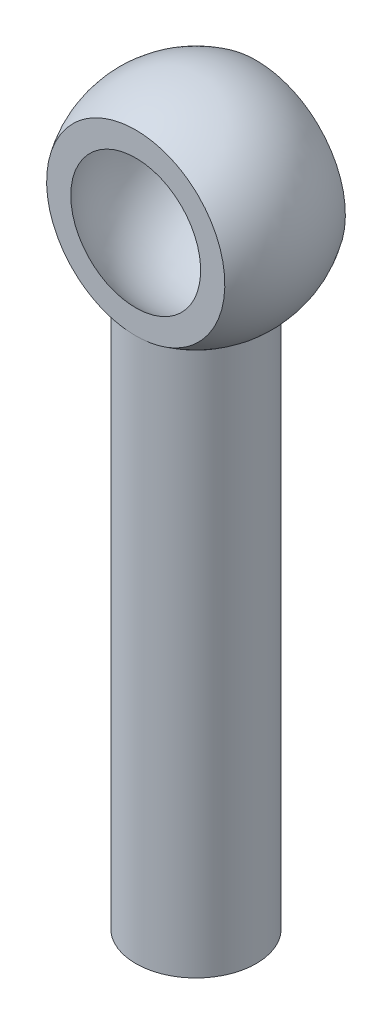
ISO-10303-21;
HEADER;
FILE_DESCRIPTION(('STEP AP214'),'2;1');
FILE_NAME('part.step','',(''),(''),'','','');
FILE_SCHEMA(('AUTOMOTIVE_DESIGN { 1 0 10303 214 1 1 1 1 }'));
ENDSEC;
DATA;
#1=APPLICATION_CONTEXT('core data for automotive mechanical design processes');
#2=APPLICATION_PROTOCOL_DEFINITION('international standard','automotive_design',2000,#1);
#3=PRODUCT_CONTEXT('',#1,'mechanical');
#4=PRODUCT('Part','Part','',(#3));
#5=PRODUCT_RELATED_PRODUCT_CATEGORY('part','',(#4));
#6=PRODUCT_DEFINITION_FORMATION('','',#4);
#7=PRODUCT_DEFINITION_CONTEXT('part definition',#1,'design');
#8=PRODUCT_DEFINITION('design','',#6,#7);
#9=PRODUCT_DEFINITION_SHAPE('','',#8);
#10=(LENGTH_UNIT() NAMED_UNIT(*) SI_UNIT(.MILLI.,.METRE.));
#11=(NAMED_UNIT(*) PLANE_ANGLE_UNIT() SI_UNIT($,.RADIAN.));
#12=(NAMED_UNIT(*) SI_UNIT($,.STERADIAN.) SOLID_ANGLE_UNIT());
#13=UNCERTAINTY_MEASURE_WITH_UNIT(LENGTH_MEASURE(1.E-05),#10,'distance_accuracy_value','');
#14=(GEOMETRIC_REPRESENTATION_CONTEXT(3) GLOBAL_UNCERTAINTY_ASSIGNED_CONTEXT((#13)) GLOBAL_UNIT_ASSIGNED_CONTEXT((#10,
#11,#12)) REPRESENTATION_CONTEXT('',''));
#15=CARTESIAN_POINT('',(0.,0.,0.));
#16=DIRECTION('',(0.,0.,1.));
#17=DIRECTION('',(1.,0.,0.));
#18=AXIS2_PLACEMENT_3D('',#15,#16,#17);
#19=CARTESIAN_POINT('',(0.,50.,0.));
#20=DIRECTION('',(0.,1.,0.));
#21=DIRECTION('',(-1.,0.,0.));
#22=AXIS2_PLACEMENT_3D('',#19,#20,#21);
#23=SPHERICAL_SURFACE('',#22,8.5);
#24=CARTESIAN_POINT('',(0.,42.959503302323,0.));
#25=DIRECTION('',(0.,1.,0.));
#26=DIRECTION('',(0.,0.,1.));
#27=AXIS2_PLACEMENT_3D('',#24,#25,#26);
#28=CIRCLE('',#27,4.7625);
#29=CARTESIAN_POINT('',(0.,42.959503302323,4.7625));
#30=VERTEX_POINT('',#29);
#31=CARTESIAN_POINT('',(-0.154292741242095,42.959503302323,-4.76));
#32=VERTEX_POINT('',#31);
#33=EDGE_CURVE('E69',#30,#32,#28,.F.);
#34=ORIENTED_EDGE('',*,*,#33,.F.);
#35=CARTESIAN_POINT('',(0.,50.,4.7625));
#36=DIRECTION('',(0.,0.,-1.));
#37=DIRECTION('',(-1.,0.,0.));
#38=AXIS2_PLACEMENT_3D('',#35,#36,#37);
#39=CIRCLE('',#38,7.04049669767695);
#40=EDGE_CURVE('E59',#30,#30,#39,.F.);
#41=ORIENTED_EDGE('',*,*,#40,.F.);
#42=CARTESIAN_POINT('',(0.154292741242095,42.959503302323,-4.76));
#43=VERTEX_POINT('',#42);
#44=EDGE_CURVE('E70',#43,#30,#28,.F.);
#45=ORIENTED_EDGE('',*,*,#44,.F.);
#46=CARTESIAN_POINT('',(0.,50.,-4.76));
#47=DIRECTION('',(0.,0.,1.));
#48=DIRECTION('',(0.,-1.,0.));
#49=AXIS2_PLACEMENT_3D('',#46,#47,#48);
#50=CIRCLE('',#49,7.04218716025072);
#51=EDGE_CURVE('E11',#32,#43,#50,.F.);
#52=ORIENTED_EDGE('',*,*,#51,.F.);
#53=EDGE_LOOP('',(#34,#41,#45,#52));
#54=FACE_BOUND('',#53,.T.);
#55=ADVANCED_FACE('F38',(#54),#23,.T.);
#56=CARTESIAN_POINT('',(0.,50.,0.));
#57=DIRECTION('',(0.,-1.,0.));
#58=DIRECTION('',(0.,0.,-1.));
#59=AXIS2_PLACEMENT_3D('',#56,#57,#58);
#60=CYLINDRICAL_SURFACE('',#59,4.7625);
#61=ORIENTED_EDGE('',*,*,#33,.T.);
#62=CARTESIAN_POINT('',(0.,42.959503302323,0.));
#63=DIRECTION('',(0.,-1.,0.));
#64=DIRECTION('',(-0.0323974259825927,0.,-0.999475065616798));
#65=AXIS2_PLACEMENT_3D('',#62,#63,#64);
#66=CIRCLE('',#65,4.7625);
#67=EDGE_CURVE('E62',#32,#43,#66,.T.);
#68=ORIENTED_EDGE('',*,*,#67,.T.);
#69=ORIENTED_EDGE('',*,*,#44,.T.);
#70=EDGE_LOOP('',(#61,#68,#69));
#71=FACE_BOUND('',#70,.T.);
#72=CARTESIAN_POINT('',(0.,0.,0.));
#73=DIRECTION('',(0.,1.,0.));
#74=DIRECTION('',(0.,0.,1.));
#75=AXIS2_PLACEMENT_3D('',#72,#73,#74);
#76=CIRCLE('',#75,4.7625);
#77=CARTESIAN_POINT('',(0.,0.,4.7625));
#78=VERTEX_POINT('',#77);
#79=EDGE_CURVE('E48',#78,#78,#76,.T.);
#80=ORIENTED_EDGE('',*,*,#79,.T.);
#81=EDGE_LOOP('',(#80));
#82=FACE_BOUND('',#81,.T.);
#83=ADVANCED_FACE('F40',(#71,#82),#60,.T.);
#84=CARTESIAN_POINT('',(0.,0.,0.));
#85=DIRECTION('',(0.,1.,0.));
#86=DIRECTION('',(0.,0.,1.));
#87=AXIS2_PLACEMENT_3D('',#84,#85,#86);
#88=PLANE('',#87);
#89=ORIENTED_EDGE('',*,*,#79,.F.);
#90=EDGE_LOOP('',(#89));
#91=FACE_BOUND('',#90,.T.);
#92=ADVANCED_FACE('F115',(#91),#88,.F.);
#93=CARTESIAN_POINT('',(-8.5,42.959503302323,-4.76));
#94=DIRECTION('',(0.,0.,1.));
#95=DIRECTION('',(0.,-1.,0.));
#96=AXIS2_PLACEMENT_3D('',#93,#94,#95);
#97=PLANE('',#96);
#98=CARTESIAN_POINT('',(0.,50.,-4.76));
#99=DIRECTION('',(0.,0.,1.));
#100=DIRECTION('',(0.,-1.,0.));
#101=AXIS2_PLACEMENT_3D('',#98,#99,#100);
#102=CIRCLE('',#101,5.13248477835054);
#103=CARTESIAN_POINT('',(0.,44.8675152216495,-4.76));
#104=VERTEX_POINT('',#103);
#105=EDGE_CURVE('E86',#104,#104,#102,.T.);
#106=ORIENTED_EDGE('',*,*,#105,.T.);
#107=EDGE_LOOP('',(#106));
#108=FACE_BOUND('',#107,.T.);
#109=ORIENTED_EDGE('',*,*,#51,.T.);
#110=ORIENTED_EDGE('',*,*,#67,.F.);
#111=EDGE_LOOP('',(#109,#110));
#112=FACE_BOUND('',#111,.T.);
#113=ADVANCED_FACE('F64',(#108,#112),#97,.F.);
#114=CARTESIAN_POINT('',(-8.5,42.959503302323,4.7625));
#115=DIRECTION('',(0.,0.,-1.));
#116=DIRECTION('',(-1.,0.,0.));
#117=AXIS2_PLACEMENT_3D('',#114,#115,#116);
#118=PLANE('',#117);
#119=CARTESIAN_POINT('',(0.,50.,4.7625));
#120=DIRECTION('',(0.,0.,-1.));
#121=DIRECTION('',(-1.,0.,0.));
#122=AXIS2_PLACEMENT_3D('',#119,#120,#121);
#123=CIRCLE('',#122,5.13016508018991);
#124=CARTESIAN_POINT('',(-5.13016508018991,50.,4.7625));
#125=VERTEX_POINT('',#124);
#126=EDGE_CURVE('E43',#125,#125,#123,.T.);
#127=ORIENTED_EDGE('',*,*,#126,.T.);
#128=EDGE_LOOP('',(#127));
#129=FACE_BOUND('',#128,.T.);
#130=ORIENTED_EDGE('',*,*,#40,.T.);
#131=EDGE_LOOP('',(#130));
#132=FACE_BOUND('',#131,.T.);
#133=ADVANCED_FACE('F100',(#129,#132),#118,.F.);
#134=CARTESIAN_POINT('',(0.,50.,0.));
#135=DIRECTION('',(0.,1.,0.));
#136=DIRECTION('',(-1.,0.,0.));
#137=AXIS2_PLACEMENT_3D('',#134,#135,#136);
#138=SPHERICAL_SURFACE('',#137,7.);
#139=CARTESIAN_POINT('',(0.,50.,0.));
#140=DIRECTION('',(0.,0.,-1.));
#141=DIRECTION('',(-1.,0.,0.));
#142=AXIS2_PLACEMENT_3D('',#139,#140,#141);
#143=SPHERICAL_SURFACE('',#142,7.);
#144=ORIENTED_EDGE('',*,*,#126,.F.);
#145=EDGE_LOOP('',(#144));
#146=FACE_BOUND('',#145,.T.);
#147=ORIENTED_EDGE('',*,*,#105,.F.);
#148=EDGE_LOOP('',(#147));
#149=FACE_BOUND('',#148,.T.);
#150=ADVANCED_FACE('F102',(#146,#149),#143,.F.);
#151=CLOSED_SHELL('',(#55,#83,#92,#113,#133,#150));
#152=MANIFOLD_SOLID_BREP('B2',#151);
#153=ADVANCED_BREP_SHAPE_REPRESENTATION('',(#18,#152),#14);
#154=SHAPE_DEFINITION_REPRESENTATION(#9,#153);
ENDSEC;
END-ISO-10303-21;
